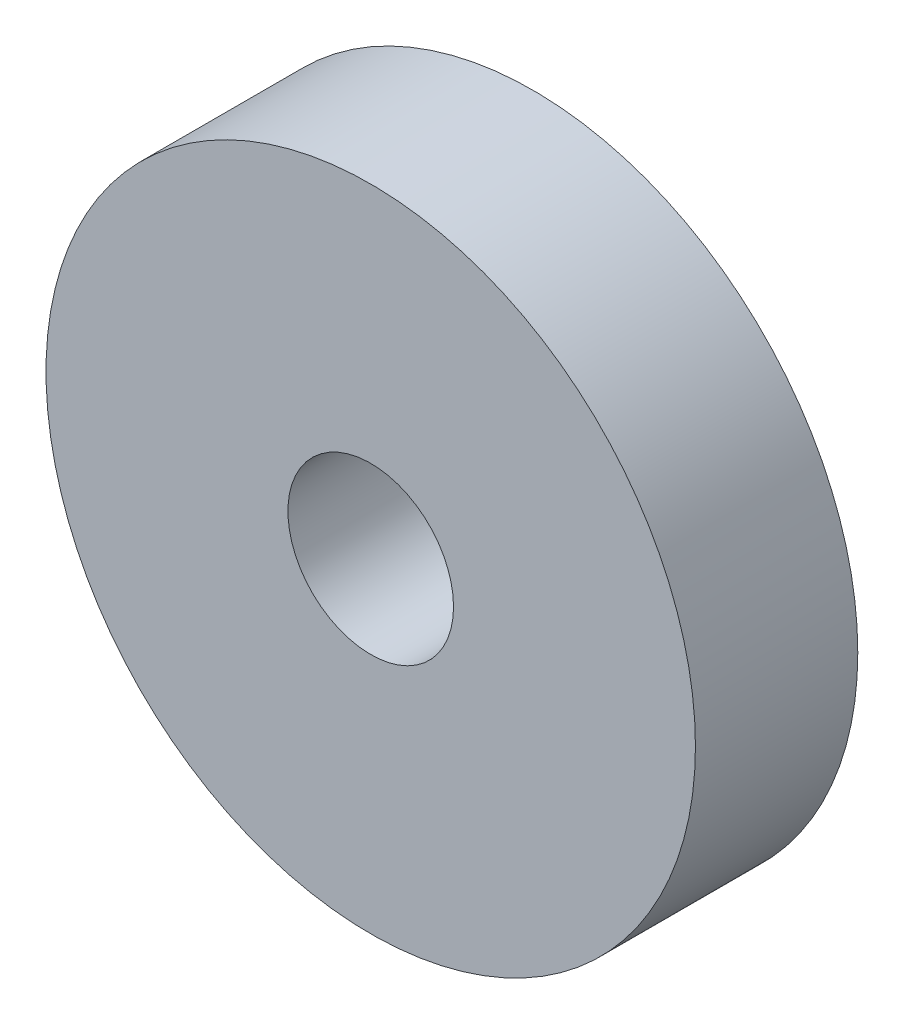
ISO-10303-21;
HEADER;
FILE_DESCRIPTION(('STEP AP214'),'2;1');
FILE_NAME('part.step','',(''),(''),'','','');
FILE_SCHEMA(('AUTOMOTIVE_DESIGN { 1 0 10303 214 1 1 1 1 }'));
ENDSEC;
DATA;
#1=APPLICATION_CONTEXT('core data for automotive mechanical design processes');
#2=APPLICATION_PROTOCOL_DEFINITION('international standard','automotive_design',2000,#1);
#3=PRODUCT_CONTEXT('',#1,'mechanical');
#4=PRODUCT('Part','Part','',(#3));
#5=PRODUCT_RELATED_PRODUCT_CATEGORY('part','',(#4));
#6=PRODUCT_DEFINITION_FORMATION('','',#4);
#7=PRODUCT_DEFINITION_CONTEXT('part definition',#1,'design');
#8=PRODUCT_DEFINITION('design','',#6,#7);
#9=PRODUCT_DEFINITION_SHAPE('','',#8);
#10=(LENGTH_UNIT() NAMED_UNIT(*) SI_UNIT(.MILLI.,.METRE.));
#11=(NAMED_UNIT(*) PLANE_ANGLE_UNIT() SI_UNIT($,.RADIAN.));
#12=(NAMED_UNIT(*) SI_UNIT($,.STERADIAN.) SOLID_ANGLE_UNIT());
#13=UNCERTAINTY_MEASURE_WITH_UNIT(LENGTH_MEASURE(1.E-05),#10,'distance_accuracy_value','');
#14=(GEOMETRIC_REPRESENTATION_CONTEXT(3) GLOBAL_UNCERTAINTY_ASSIGNED_CONTEXT((#13)) GLOBAL_UNIT_ASSIGNED_CONTEXT((#10,
#11,#12)) REPRESENTATION_CONTEXT('',''));
#15=CARTESIAN_POINT('',(0.,0.,0.));
#16=DIRECTION('',(0.,0.,1.));
#17=DIRECTION('',(1.,0.,0.));
#18=AXIS2_PLACEMENT_3D('',#15,#16,#17);
#19=CARTESIAN_POINT('',(0.,0.,5.));
#20=DIRECTION('',(0.,0.,1.));
#21=DIRECTION('',(1.,0.,0.));
#22=AXIS2_PLACEMENT_3D('',#19,#20,#21);
#23=PLANE('',#22);
#24=CARTESIAN_POINT('',(0.,0.,5.));
#25=DIRECTION('',(0.,0.,1.));
#26=DIRECTION('',(1.,0.,0.));
#27=AXIS2_PLACEMENT_3D('',#24,#25,#26);
#28=CIRCLE('',#27,10.);
#29=CARTESIAN_POINT('',(10.,0.,5.));
#30=VERTEX_POINT('',#29);
#31=EDGE_CURVE('E10',#30,#30,#28,.T.);
#32=ORIENTED_EDGE('',*,*,#31,.T.);
#33=EDGE_LOOP('',(#32));
#34=FACE_BOUND('',#33,.T.);
#35=CARTESIAN_POINT('',(0.,0.,5.));
#36=DIRECTION('',(0.,0.,1.));
#37=DIRECTION('',(1.,0.,0.));
#38=AXIS2_PLACEMENT_3D('',#35,#36,#37);
#39=CIRCLE('',#38,2.55);
#40=CARTESIAN_POINT('',(2.55,0.,5.));
#41=VERTEX_POINT('',#40);
#42=EDGE_CURVE('E42',#41,#41,#39,.T.);
#43=ORIENTED_EDGE('',*,*,#42,.F.);
#44=EDGE_LOOP('',(#43));
#45=FACE_BOUND('',#44,.T.);
#46=ADVANCED_FACE('F31',(#34,#45),#23,.T.);
#47=CARTESIAN_POINT('',(0.,0.,0.));
#48=DIRECTION('',(0.,0.,1.));
#49=DIRECTION('',(1.,0.,0.));
#50=AXIS2_PLACEMENT_3D('',#47,#48,#49);
#51=PLANE('',#50);
#52=CARTESIAN_POINT('',(0.,0.,0.));
#53=DIRECTION('',(0.,0.,1.));
#54=DIRECTION('',(1.,0.,0.));
#55=AXIS2_PLACEMENT_3D('',#52,#53,#54);
#56=CIRCLE('',#55,10.);
#57=CARTESIAN_POINT('',(10.,0.,0.));
#58=VERTEX_POINT('',#57);
#59=EDGE_CURVE('E35',#58,#58,#56,.T.);
#60=ORIENTED_EDGE('',*,*,#59,.F.);
#61=EDGE_LOOP('',(#60));
#62=FACE_BOUND('',#61,.T.);
#63=CARTESIAN_POINT('',(0.,0.,0.));
#64=DIRECTION('',(0.,0.,1.));
#65=DIRECTION('',(1.,0.,0.));
#66=AXIS2_PLACEMENT_3D('',#63,#64,#65);
#67=CIRCLE('',#66,2.55);
#68=CARTESIAN_POINT('',(2.55,0.,0.));
#69=VERTEX_POINT('',#68);
#70=EDGE_CURVE('E44',#69,#69,#67,.T.);
#71=ORIENTED_EDGE('',*,*,#70,.T.);
#72=EDGE_LOOP('',(#71));
#73=FACE_BOUND('',#72,.T.);
#74=ADVANCED_FACE('F54',(#62,#73),#51,.F.);
#75=CARTESIAN_POINT('',(0.,0.,5.));
#76=DIRECTION('',(0.,0.,-1.));
#77=DIRECTION('',(-1.,0.,0.));
#78=AXIS2_PLACEMENT_3D('',#75,#76,#77);
#79=CYLINDRICAL_SURFACE('',#78,10.);
#80=ORIENTED_EDGE('',*,*,#31,.F.);
#81=EDGE_LOOP('',(#80));
#82=FACE_BOUND('',#81,.T.);
#83=ORIENTED_EDGE('',*,*,#59,.T.);
#84=EDGE_LOOP('',(#83));
#85=FACE_BOUND('',#84,.T.);
#86=ADVANCED_FACE('F33',(#82,#85),#79,.T.);
#87=CARTESIAN_POINT('',(0.,0.,5.));
#88=DIRECTION('',(0.,0.,-1.));
#89=DIRECTION('',(-1.,0.,0.));
#90=AXIS2_PLACEMENT_3D('',#87,#88,#89);
#91=CYLINDRICAL_SURFACE('',#90,2.55);
#92=ORIENTED_EDGE('',*,*,#42,.T.);
#93=EDGE_LOOP('',(#92));
#94=FACE_BOUND('',#93,.T.);
#95=ORIENTED_EDGE('',*,*,#70,.F.);
#96=EDGE_LOOP('',(#95));
#97=FACE_BOUND('',#96,.T.);
#98=ADVANCED_FACE('F50',(#94,#97),#91,.F.);
#99=CLOSED_SHELL('',(#46,#74,#86,#98));
#100=MANIFOLD_SOLID_BREP('B2',#99);
#101=ADVANCED_BREP_SHAPE_REPRESENTATION('',(#18,#100),#14);
#102=SHAPE_DEFINITION_REPRESENTATION(#9,#101);
ENDSEC;
END-ISO-10303-21;
